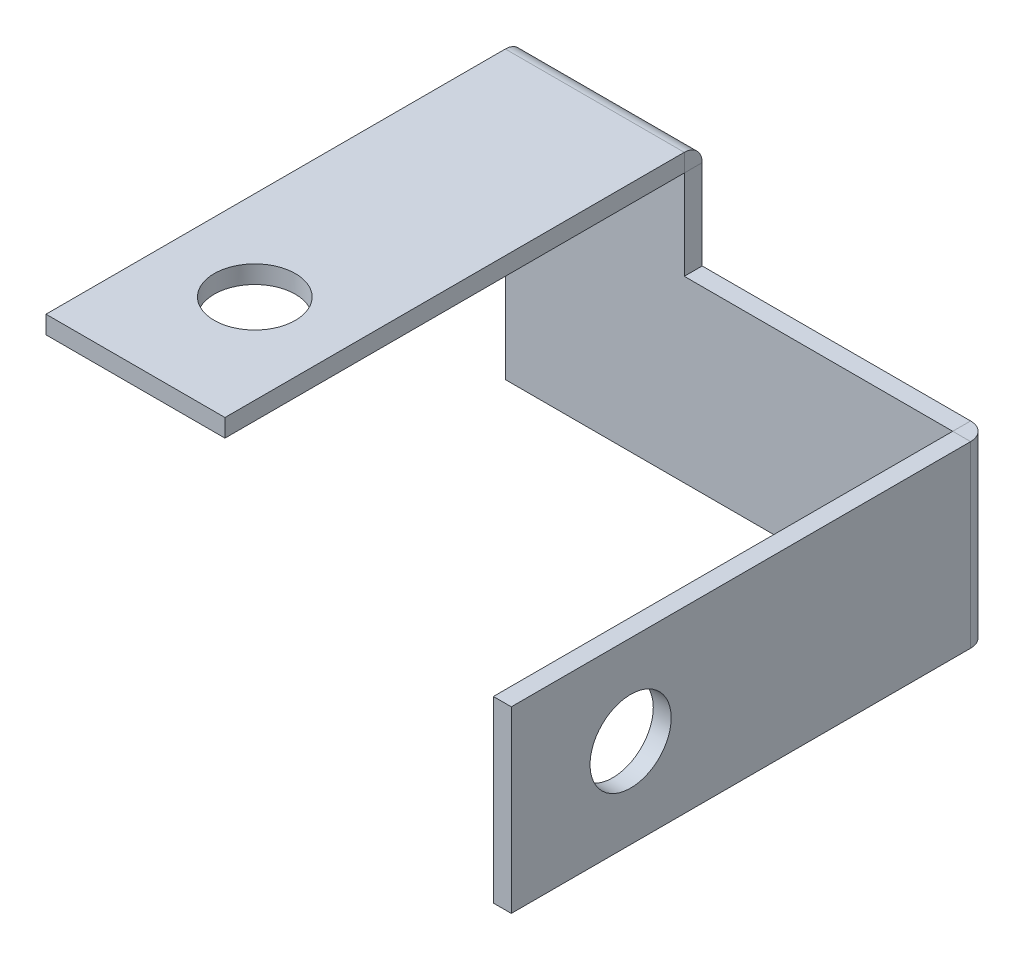
ISO-10303-21;
HEADER;
FILE_DESCRIPTION(('STEP AP214'),'2;1');
FILE_NAME('part.step','',(''),(''),'','','');
FILE_SCHEMA(('AUTOMOTIVE_DESIGN { 1 0 10303 214 1 1 1 1 }'));
ENDSEC;
DATA;
#1=APPLICATION_CONTEXT('core data for automotive mechanical design processes');
#2=APPLICATION_PROTOCOL_DEFINITION('international standard','automotive_design',2000,#1);
#3=PRODUCT_CONTEXT('',#1,'mechanical');
#4=PRODUCT('Part','Part','',(#3));
#5=PRODUCT_RELATED_PRODUCT_CATEGORY('part','',(#4));
#6=PRODUCT_DEFINITION_FORMATION('','',#4);
#7=PRODUCT_DEFINITION_CONTEXT('part definition',#1,'design');
#8=PRODUCT_DEFINITION('design','',#6,#7);
#9=PRODUCT_DEFINITION_SHAPE('','',#8);
#10=(LENGTH_UNIT() NAMED_UNIT(*) SI_UNIT(.MILLI.,.METRE.));
#11=(NAMED_UNIT(*) PLANE_ANGLE_UNIT() SI_UNIT($,.RADIAN.));
#12=(NAMED_UNIT(*) SI_UNIT($,.STERADIAN.) SOLID_ANGLE_UNIT());
#13=UNCERTAINTY_MEASURE_WITH_UNIT(LENGTH_MEASURE(1.E-05),#10,'distance_accuracy_value','');
#14=(GEOMETRIC_REPRESENTATION_CONTEXT(3) GLOBAL_UNCERTAINTY_ASSIGNED_CONTEXT((#13)) GLOBAL_UNIT_ASSIGNED_CONTEXT((#10,
#11,#12)) REPRESENTATION_CONTEXT('',''));
#15=CARTESIAN_POINT('',(0.,0.,0.));
#16=DIRECTION('',(0.,0.,1.));
#17=DIRECTION('',(1.,0.,0.));
#18=AXIS2_PLACEMENT_3D('',#15,#16,#17);
#19=CARTESIAN_POINT('',(0.,0.,-1.5));
#20=DIRECTION('',(0.,0.,-1.));
#21=DIRECTION('',(-1.,0.,0.));
#22=AXIS2_PLACEMENT_3D('',#19,#20,#21);
#23=PLANE('',#22);
#24=DIRECTION('',(-1.,0.,0.));
#25=VECTOR('',#24,1.);
#26=CARTESIAN_POINT('',(24.,0.,-1.5));
#27=LINE('',#26,#25);
#28=CARTESIAN_POINT('',(22.5,0.,-1.5));
#29=VERTEX_POINT('',#28);
#30=CARTESIAN_POINT('',(0.,0.,-1.5));
#31=VERTEX_POINT('',#30);
#32=EDGE_CURVE('E301',#29,#31,#27,.T.);
#33=ORIENTED_EDGE('',*,*,#32,.F.);
#34=DIRECTION('',(0.,1.,0.));
#35=VECTOR('',#34,1.);
#36=CARTESIAN_POINT('',(22.4999999999999,0.,-1.5));
#37=LINE('',#36,#35);
#38=CARTESIAN_POINT('',(22.5,-15.,-1.5));
#39=VERTEX_POINT('',#38);
#40=EDGE_CURVE('E227',#39,#29,#37,.T.);
#41=ORIENTED_EDGE('',*,*,#40,.F.);
#42=DIRECTION('',(1.,0.,0.));
#43=VECTOR('',#42,1.);
#44=CARTESIAN_POINT('',(-15.,-15.,-1.5));
#45=LINE('',#44,#43);
#46=CARTESIAN_POINT('',(-15.,-15.,-1.5));
#47=VERTEX_POINT('',#46);
#48=EDGE_CURVE('E311',#47,#39,#45,.T.);
#49=ORIENTED_EDGE('',*,*,#48,.F.);
#50=DIRECTION('',(0.,-1.,0.));
#51=VECTOR('',#50,1.);
#52=CARTESIAN_POINT('',(-15.,9.,-1.5));
#53=LINE('',#52,#51);
#54=CARTESIAN_POINT('',(-15.,7.50000000000001,-1.5));
#55=VERTEX_POINT('',#54);
#56=EDGE_CURVE('E308',#55,#47,#53,.T.);
#57=ORIENTED_EDGE('',*,*,#56,.F.);
#58=DIRECTION('',(-1.,0.,0.));
#59=VECTOR('',#58,1.);
#60=CARTESIAN_POINT('',(0.,7.49999999999996,-1.5));
#61=LINE('',#60,#59);
#62=CARTESIAN_POINT('',(0.,7.49999999999997,-1.5));
#63=VERTEX_POINT('',#62);
#64=EDGE_CURVE('E286',#63,#55,#61,.T.);
#65=ORIENTED_EDGE('',*,*,#64,.F.);
#66=DIRECTION('',(0.,1.,0.));
#67=VECTOR('',#66,1.);
#68=CARTESIAN_POINT('',(0.,0.,-1.5));
#69=LINE('',#68,#67);
#70=EDGE_CURVE('E304',#31,#63,#69,.T.);
#71=ORIENTED_EDGE('',*,*,#70,.F.);
#72=EDGE_LOOP('',(#33,#41,#49,#57,#65,#71));
#73=FACE_BOUND('',#72,.T.);
#74=ADVANCED_FACE('F82',(#73),#23,.T.);
#75=CARTESIAN_POINT('',(0.,0.,0.));
#76=DIRECTION('',(0.,0.,-1.));
#77=DIRECTION('',(-1.,0.,0.));
#78=AXIS2_PLACEMENT_3D('',#75,#76,#77);
#79=PLANE('',#78);
#80=DIRECTION('',(0.,-1.,0.));
#81=VECTOR('',#80,1.);
#82=CARTESIAN_POINT('',(22.5,-15.,0.));
#83=LINE('',#82,#81);
#84=CARTESIAN_POINT('',(22.5,-15.,0.));
#85=VERTEX_POINT('',#84);
#86=CARTESIAN_POINT('',(22.5,0.,0.));
#87=VERTEX_POINT('',#86);
#88=EDGE_CURVE('E217',#85,#87,#83,.F.);
#89=ORIENTED_EDGE('',*,*,#88,.T.);
#90=DIRECTION('',(-1.,0.,0.));
#91=VECTOR('',#90,1.);
#92=CARTESIAN_POINT('',(24.,0.,0.));
#93=LINE('',#92,#91);
#94=CARTESIAN_POINT('',(0.,0.,0.));
#95=VERTEX_POINT('',#94);
#96=EDGE_CURVE('E300',#87,#95,#93,.T.);
#97=ORIENTED_EDGE('',*,*,#96,.T.);
#98=DIRECTION('',(0.,1.,0.));
#99=VECTOR('',#98,1.);
#100=CARTESIAN_POINT('',(0.,0.,0.));
#101=LINE('',#100,#99);
#102=CARTESIAN_POINT('',(0.,7.5,0.));
#103=VERTEX_POINT('',#102);
#104=EDGE_CURVE('E316',#95,#103,#101,.T.);
#105=ORIENTED_EDGE('',*,*,#104,.T.);
#106=DIRECTION('',(1.,0.,0.));
#107=VECTOR('',#106,1.);
#108=CARTESIAN_POINT('',(0.,7.5,0.));
#109=LINE('',#108,#107);
#110=CARTESIAN_POINT('',(-15.,7.5,0.));
#111=VERTEX_POINT('',#110);
#112=EDGE_CURVE('E277',#103,#111,#109,.F.);
#113=ORIENTED_EDGE('',*,*,#112,.T.);
#114=DIRECTION('',(0.,-1.,0.));
#115=VECTOR('',#114,1.);
#116=CARTESIAN_POINT('',(-15.,9.,0.));
#117=LINE('',#116,#115);
#118=CARTESIAN_POINT('',(-15.,-15.,0.));
#119=VERTEX_POINT('',#118);
#120=EDGE_CURVE('E319',#111,#119,#117,.T.);
#121=ORIENTED_EDGE('',*,*,#120,.T.);
#122=DIRECTION('',(1.,0.,0.));
#123=VECTOR('',#122,1.);
#124=CARTESIAN_POINT('',(-15.,-15.,0.));
#125=LINE('',#124,#123);
#126=EDGE_CURVE('E305',#119,#85,#125,.T.);
#127=ORIENTED_EDGE('',*,*,#126,.T.);
#128=EDGE_LOOP('',(#89,#97,#105,#113,#121,#127));
#129=FACE_BOUND('',#128,.T.);
#130=ADVANCED_FACE('F333',(#129),#79,.F.);
#131=CARTESIAN_POINT('',(24.,0.,-1.5));
#132=DIRECTION('',(0.,1.,0.));
#133=DIRECTION('',(-1.,0.,0.));
#134=AXIS2_PLACEMENT_3D('',#131,#132,#133);
#135=PLANE('',#134);
#136=ORIENTED_EDGE('',*,*,#96,.F.);
#137=DIRECTION('',(0.,0.,1.));
#138=VECTOR('',#137,1.);
#139=CARTESIAN_POINT('',(22.5,0.,-1.5));
#140=LINE('',#139,#138);
#141=EDGE_CURVE('E100',#29,#87,#140,.T.);
#142=ORIENTED_EDGE('',*,*,#141,.F.);
#143=ORIENTED_EDGE('',*,*,#32,.T.);
#144=DIRECTION('',(0.,0.,1.));
#145=VECTOR('',#144,1.);
#146=CARTESIAN_POINT('',(0.,0.,-1.5));
#147=LINE('',#146,#145);
#148=EDGE_CURVE('E92',#31,#95,#147,.T.);
#149=ORIENTED_EDGE('',*,*,#148,.T.);
#150=EDGE_LOOP('',(#136,#142,#143,#149));
#151=FACE_BOUND('',#150,.T.);
#152=ADVANCED_FACE('F84',(#151),#135,.T.);
#153=CARTESIAN_POINT('',(-15.,9.,-1.5));
#154=DIRECTION('',(-1.,0.,0.));
#155=DIRECTION('',(0.,-1.,0.));
#156=AXIS2_PLACEMENT_3D('',#153,#154,#155);
#157=PLANE('',#156);
#158=ORIENTED_EDGE('',*,*,#120,.F.);
#159=DIRECTION('',(0.,0.,1.));
#160=VECTOR('',#159,1.);
#161=CARTESIAN_POINT('',(-15.,7.49999999999999,-1.5));
#162=LINE('',#161,#160);
#163=EDGE_CURVE('E244',#55,#111,#162,.T.);
#164=ORIENTED_EDGE('',*,*,#163,.F.);
#165=ORIENTED_EDGE('',*,*,#56,.T.);
#166=DIRECTION('',(0.,0.,1.));
#167=VECTOR('',#166,1.);
#168=CARTESIAN_POINT('',(-15.,-15.,-1.5));
#169=LINE('',#168,#167);
#170=EDGE_CURVE('E13',#47,#119,#169,.T.);
#171=ORIENTED_EDGE('',*,*,#170,.T.);
#172=EDGE_LOOP('',(#158,#164,#165,#171));
#173=FACE_BOUND('',#172,.T.);
#174=ADVANCED_FACE('F377',(#173),#157,.T.);
#175=CARTESIAN_POINT('',(-15.,-15.,-1.5));
#176=DIRECTION('',(0.,-1.,0.));
#177=DIRECTION('',(0.,0.,-1.));
#178=AXIS2_PLACEMENT_3D('',#175,#176,#177);
#179=PLANE('',#178);
#180=DIRECTION('',(0.,0.,1.));
#181=VECTOR('',#180,1.);
#182=CARTESIAN_POINT('',(22.5,-15.,-1.5));
#183=LINE('',#182,#181);
#184=EDGE_CURVE('E108',#39,#85,#183,.T.);
#185=ORIENTED_EDGE('',*,*,#184,.T.);
#186=ORIENTED_EDGE('',*,*,#126,.F.);
#187=ORIENTED_EDGE('',*,*,#170,.F.);
#188=ORIENTED_EDGE('',*,*,#48,.T.);
#189=EDGE_LOOP('',(#185,#186,#187,#188));
#190=FACE_BOUND('',#189,.T.);
#191=ADVANCED_FACE('F374',(#190),#179,.T.);
#192=CARTESIAN_POINT('',(0.,0.,-1.5));
#193=DIRECTION('',(1.,0.,0.));
#194=DIRECTION('',(0.,0.,-1.));
#195=AXIS2_PLACEMENT_3D('',#192,#193,#194);
#196=PLANE('',#195);
#197=DIRECTION('',(0.,0.,1.));
#198=VECTOR('',#197,1.);
#199=CARTESIAN_POINT('',(0.,7.49999999999999,-1.5));
#200=LINE('',#199,#198);
#201=EDGE_CURVE('E290',#63,#103,#200,.T.);
#202=ORIENTED_EDGE('',*,*,#201,.T.);
#203=ORIENTED_EDGE('',*,*,#104,.F.);
#204=ORIENTED_EDGE('',*,*,#148,.F.);
#205=ORIENTED_EDGE('',*,*,#70,.T.);
#206=EDGE_LOOP('',(#202,#203,#204,#205));
#207=FACE_BOUND('',#206,.T.);
#208=ADVANCED_FACE('F330',(#207),#196,.T.);
#209=CARTESIAN_POINT('',(-15.,7.49999999999999,-1.5));
#210=DIRECTION('',(-1.,0.,0.));
#211=DIRECTION('',(0.,-1.,0.));
#212=AXIS2_PLACEMENT_3D('',#209,#210,#211);
#213=PLANE('',#212);
#214=CARTESIAN_POINT('',(-15.,7.5,0.));
#215=DIRECTION('',(1.,0.,0.));
#216=DIRECTION('',(0.,1.,0.));
#217=AXIS2_PLACEMENT_3D('',#214,#215,#216);
#218=CIRCLE('',#217,1.5);
#219=CARTESIAN_POINT('',(-15.,9.,0.));
#220=VERTEX_POINT('',#219);
#221=EDGE_CURVE('E297',#55,#220,#218,.T.);
#222=ORIENTED_EDGE('',*,*,#221,.F.);
#223=ORIENTED_EDGE('',*,*,#163,.T.);
#224=DIRECTION('',(0.,-1.,0.));
#225=VECTOR('',#224,1.);
#226=CARTESIAN_POINT('',(-15.,9.,0.));
#227=LINE('',#226,#225);
#228=EDGE_CURVE('E245',#220,#111,#227,.T.);
#229=ORIENTED_EDGE('',*,*,#228,.F.);
#230=EDGE_LOOP('',(#222,#223,#229));
#231=FACE_BOUND('',#230,.T.);
#232=ADVANCED_FACE('F371',(#231),#213,.T.);
#233=CARTESIAN_POINT('',(0.,7.5,0.));
#234=DIRECTION('',(1.,0.,0.));
#235=DIRECTION('',(0.,1.,0.));
#236=AXIS2_PLACEMENT_3D('',#233,#234,#235);
#237=CYLINDRICAL_SURFACE('',#236,1.5);
#238=CARTESIAN_POINT('',(0.,7.5,0.));
#239=DIRECTION('',(1.,0.,0.));
#240=DIRECTION('',(0.,1.,0.));
#241=AXIS2_PLACEMENT_3D('',#238,#239,#240);
#242=CIRCLE('',#241,1.5);
#243=CARTESIAN_POINT('',(0.,9.,0.));
#244=VERTEX_POINT('',#243);
#245=EDGE_CURVE('E294',#63,#244,#242,.T.);
#246=ORIENTED_EDGE('',*,*,#245,.F.);
#247=ORIENTED_EDGE('',*,*,#64,.T.);
#248=ORIENTED_EDGE('',*,*,#221,.T.);
#249=DIRECTION('',(-1.,0.,0.));
#250=VECTOR('',#249,1.);
#251=CARTESIAN_POINT('',(0.,9.,0.));
#252=LINE('',#251,#250);
#253=EDGE_CURVE('E263',#244,#220,#252,.T.);
#254=ORIENTED_EDGE('',*,*,#253,.F.);
#255=EDGE_LOOP('',(#246,#247,#248,#254));
#256=FACE_BOUND('',#255,.T.);
#257=ADVANCED_FACE('F384',(#256),#237,.T.);
#258=CARTESIAN_POINT('',(0.,7.49999999999999,-1.5));
#259=DIRECTION('',(-1.,0.,0.));
#260=DIRECTION('',(0.,-1.,0.));
#261=AXIS2_PLACEMENT_3D('',#258,#259,#260);
#262=PLANE('',#261);
#263=ORIENTED_EDGE('',*,*,#201,.F.);
#264=ORIENTED_EDGE('',*,*,#245,.T.);
#265=DIRECTION('',(0.,-1.,0.));
#266=VECTOR('',#265,1.);
#267=CARTESIAN_POINT('',(0.,9.,0.));
#268=LINE('',#267,#266);
#269=EDGE_CURVE('E240',#244,#103,#268,.T.);
#270=ORIENTED_EDGE('',*,*,#269,.T.);
#271=EDGE_LOOP('',(#263,#264,#270));
#272=FACE_BOUND('',#271,.T.);
#273=ADVANCED_FACE('F389',(#272),#262,.F.);
#274=CARTESIAN_POINT('',(0.,9.,0.));
#275=DIRECTION('',(-1.,0.,0.));
#276=DIRECTION('',(0.,-1.,0.));
#277=AXIS2_PLACEMENT_3D('',#274,#275,#276);
#278=PLANE('',#277);
#279=DIRECTION('',(0.,0.,1.));
#280=VECTOR('',#279,1.);
#281=CARTESIAN_POINT('',(0.,7.5,0.));
#282=LINE('',#281,#280);
#283=CARTESIAN_POINT('',(0.,7.50000000000013,38.5));
#284=VERTEX_POINT('',#283);
#285=EDGE_CURVE('E239',#284,#103,#282,.F.);
#286=ORIENTED_EDGE('',*,*,#285,.T.);
#287=ORIENTED_EDGE('',*,*,#269,.F.);
#288=DIRECTION('',(0.,0.,-1.));
#289=VECTOR('',#288,1.);
#290=CARTESIAN_POINT('',(0.,9.,0.));
#291=LINE('',#290,#289);
#292=CARTESIAN_POINT('',(0.,9.00000000000013,38.5));
#293=VERTEX_POINT('',#292);
#294=EDGE_CURVE('E267',#293,#244,#291,.T.);
#295=ORIENTED_EDGE('',*,*,#294,.F.);
#296=DIRECTION('',(0.,-1.,0.));
#297=VECTOR('',#296,1.);
#298=CARTESIAN_POINT('',(0.,9.00000000000013,38.5));
#299=LINE('',#298,#297);
#300=EDGE_CURVE('E253',#293,#284,#299,.T.);
#301=ORIENTED_EDGE('',*,*,#300,.T.);
#302=EDGE_LOOP('',(#286,#287,#295,#301));
#303=FACE_BOUND('',#302,.T.);
#304=ADVANCED_FACE('F449',(#303),#278,.F.);
#305=CARTESIAN_POINT('',(-15.,9.00000000000013,38.5));
#306=DIRECTION('',(1.,0.,0.));
#307=DIRECTION('',(0.,1.,0.));
#308=AXIS2_PLACEMENT_3D('',#305,#306,#307);
#309=PLANE('',#308);
#310=DIRECTION('',(0.,0.,-1.));
#311=VECTOR('',#310,1.);
#312=CARTESIAN_POINT('',(-15.,7.50000000000013,38.5));
#313=LINE('',#312,#311);
#314=CARTESIAN_POINT('',(-15.,7.50000000000013,38.5));
#315=VERTEX_POINT('',#314);
#316=EDGE_CURVE('E274',#111,#315,#313,.F.);
#317=ORIENTED_EDGE('',*,*,#316,.T.);
#318=DIRECTION('',(0.,-1.,0.));
#319=VECTOR('',#318,1.);
#320=CARTESIAN_POINT('',(-15.,9.00000000000013,38.5));
#321=LINE('',#320,#319);
#322=CARTESIAN_POINT('',(-15.,9.00000000000013,38.5));
#323=VERTEX_POINT('',#322);
#324=EDGE_CURVE('E249',#323,#315,#321,.T.);
#325=ORIENTED_EDGE('',*,*,#324,.F.);
#326=DIRECTION('',(0.,0.,1.));
#327=VECTOR('',#326,1.);
#328=CARTESIAN_POINT('',(-15.,9.,0.));
#329=LINE('',#328,#327);
#330=EDGE_CURVE('E260',#220,#323,#329,.T.);
#331=ORIENTED_EDGE('',*,*,#330,.F.);
#332=ORIENTED_EDGE('',*,*,#228,.T.);
#333=EDGE_LOOP('',(#317,#325,#331,#332));
#334=FACE_BOUND('',#333,.T.);
#335=ADVANCED_FACE('F458',(#334),#309,.F.);
#336=CARTESIAN_POINT('',(0.,9.00000000000013,38.5));
#337=DIRECTION('',(0.,0.,-1.));
#338=DIRECTION('',(0.,1.,0.));
#339=AXIS2_PLACEMENT_3D('',#336,#337,#338);
#340=PLANE('',#339);
#341=DIRECTION('',(-1.,0.,0.));
#342=VECTOR('',#341,1.);
#343=CARTESIAN_POINT('',(0.,7.50000000000013,38.5));
#344=LINE('',#343,#342);
#345=EDGE_CURVE('E271',#315,#284,#344,.F.);
#346=ORIENTED_EDGE('',*,*,#345,.T.);
#347=ORIENTED_EDGE('',*,*,#300,.F.);
#348=DIRECTION('',(1.,0.,0.));
#349=VECTOR('',#348,1.);
#350=CARTESIAN_POINT('',(0.,9.00000000000013,38.5));
#351=LINE('',#350,#349);
#352=EDGE_CURVE('E257',#323,#293,#351,.T.);
#353=ORIENTED_EDGE('',*,*,#352,.F.);
#354=ORIENTED_EDGE('',*,*,#324,.T.);
#355=EDGE_LOOP('',(#346,#347,#353,#354));
#356=FACE_BOUND('',#355,.T.);
#357=ADVANCED_FACE('F454',(#356),#340,.F.);
#358=CARTESIAN_POINT('',(0.,9.,0.));
#359=DIRECTION('',(0.,-1.,0.));
#360=DIRECTION('',(0.,0.,-1.));
#361=AXIS2_PLACEMENT_3D('',#358,#359,#360);
#362=PLANE('',#361);
#363=CARTESIAN_POINT('',(-7.5,9.00000000000014,28.5));
#364=DIRECTION('',(0.,1.,0.));
#365=DIRECTION('',(0.,0.,1.));
#366=AXIS2_PLACEMENT_3D('',#363,#364,#365);
#367=CIRCLE('',#366,3.39999999999999);
#368=CARTESIAN_POINT('',(-7.5,9.00000000000015,31.9));
#369=VERTEX_POINT('',#368);
#370=EDGE_CURVE('E426',#369,#369,#367,.T.);
#371=ORIENTED_EDGE('',*,*,#370,.F.);
#372=EDGE_LOOP('',(#371));
#373=FACE_BOUND('',#372,.T.);
#374=ORIENTED_EDGE('',*,*,#294,.T.);
#375=ORIENTED_EDGE('',*,*,#253,.T.);
#376=ORIENTED_EDGE('',*,*,#330,.T.);
#377=ORIENTED_EDGE('',*,*,#352,.T.);
#378=EDGE_LOOP('',(#374,#375,#376,#377));
#379=FACE_BOUND('',#378,.T.);
#380=ADVANCED_FACE('F442',(#373,#379),#362,.F.);
#381=CARTESIAN_POINT('',(0.,7.5,0.));
#382=DIRECTION('',(0.,-1.,0.));
#383=DIRECTION('',(0.,0.,-1.));
#384=AXIS2_PLACEMENT_3D('',#381,#382,#383);
#385=PLANE('',#384);
#386=CARTESIAN_POINT('',(-7.5,7.5000000000001,28.5));
#387=DIRECTION('',(0.,-1.,0.));
#388=DIRECTION('',(0.,0.,-1.));
#389=AXIS2_PLACEMENT_3D('',#386,#387,#388);
#390=CIRCLE('',#389,3.39999999999999);
#391=CARTESIAN_POINT('',(-7.5,7.50000000000009,25.1));
#392=VERTEX_POINT('',#391);
#393=EDGE_CURVE('E86',#392,#392,#390,.T.);
#394=ORIENTED_EDGE('',*,*,#393,.F.);
#395=EDGE_LOOP('',(#394));
#396=FACE_BOUND('',#395,.T.);
#397=ORIENTED_EDGE('',*,*,#285,.F.);
#398=ORIENTED_EDGE('',*,*,#345,.F.);
#399=ORIENTED_EDGE('',*,*,#316,.F.);
#400=ORIENTED_EDGE('',*,*,#112,.F.);
#401=EDGE_LOOP('',(#397,#398,#399,#400));
#402=FACE_BOUND('',#401,.T.);
#403=ADVANCED_FACE('F438',(#396,#402),#385,.T.);
#404=CARTESIAN_POINT('',(22.5,0.,-1.5));
#405=DIRECTION('',(0.,1.,0.));
#406=DIRECTION('',(-1.,0.,0.));
#407=AXIS2_PLACEMENT_3D('',#404,#405,#406);
#408=PLANE('',#407);
#409=CARTESIAN_POINT('',(22.5,0.,0.));
#410=DIRECTION('',(0.,-1.,0.));
#411=DIRECTION('',(1.,0.,0.));
#412=AXIS2_PLACEMENT_3D('',#409,#410,#411);
#413=CIRCLE('',#412,1.5);
#414=CARTESIAN_POINT('',(24.,0.,0.));
#415=VERTEX_POINT('',#414);
#416=EDGE_CURVE('E236',#29,#415,#413,.T.);
#417=ORIENTED_EDGE('',*,*,#416,.F.);
#418=ORIENTED_EDGE('',*,*,#141,.T.);
#419=DIRECTION('',(-1.,0.,0.));
#420=VECTOR('',#419,1.);
#421=CARTESIAN_POINT('',(24.,0.,0.));
#422=LINE('',#421,#420);
#423=EDGE_CURVE('E341',#415,#87,#422,.T.);
#424=ORIENTED_EDGE('',*,*,#423,.F.);
#425=EDGE_LOOP('',(#417,#418,#424));
#426=FACE_BOUND('',#425,.T.);
#427=ADVANCED_FACE('F441',(#426),#408,.T.);
#428=CARTESIAN_POINT('',(22.5,-15.,0.));
#429=DIRECTION('',(0.,-1.,0.));
#430=DIRECTION('',(1.,0.,0.));
#431=AXIS2_PLACEMENT_3D('',#428,#429,#430);
#432=CYLINDRICAL_SURFACE('',#431,1.5);
#433=CARTESIAN_POINT('',(22.5,-15.,0.));
#434=DIRECTION('',(0.,-1.,0.));
#435=DIRECTION('',(1.,0.,0.));
#436=AXIS2_PLACEMENT_3D('',#433,#434,#435);
#437=CIRCLE('',#436,1.5);
#438=CARTESIAN_POINT('',(24.,-15.,0.));
#439=VERTEX_POINT('',#438);
#440=EDGE_CURVE('E233',#39,#439,#437,.T.);
#441=ORIENTED_EDGE('',*,*,#440,.F.);
#442=ORIENTED_EDGE('',*,*,#40,.T.);
#443=ORIENTED_EDGE('',*,*,#416,.T.);
#444=DIRECTION('',(0.,1.,0.));
#445=VECTOR('',#444,1.);
#446=CARTESIAN_POINT('',(24.,0.,0.));
#447=LINE('',#446,#445);
#448=EDGE_CURVE('E205',#439,#415,#447,.T.);
#449=ORIENTED_EDGE('',*,*,#448,.F.);
#450=EDGE_LOOP('',(#441,#442,#443,#449));
#451=FACE_BOUND('',#450,.T.);
#452=ADVANCED_FACE('F403',(#451),#432,.T.);
#453=CARTESIAN_POINT('',(22.5,-15.,-1.5));
#454=DIRECTION('',(0.,1.,0.));
#455=DIRECTION('',(-1.,0.,0.));
#456=AXIS2_PLACEMENT_3D('',#453,#454,#455);
#457=PLANE('',#456);
#458=ORIENTED_EDGE('',*,*,#184,.F.);
#459=ORIENTED_EDGE('',*,*,#440,.T.);
#460=DIRECTION('',(-1.,0.,0.));
#461=VECTOR('',#460,1.);
#462=CARTESIAN_POINT('',(24.,-15.,0.));
#463=LINE('',#462,#461);
#464=EDGE_CURVE('E203',#439,#85,#463,.T.);
#465=ORIENTED_EDGE('',*,*,#464,.T.);
#466=EDGE_LOOP('',(#458,#459,#465));
#467=FACE_BOUND('',#466,.T.);
#468=ADVANCED_FACE('F405',(#467),#457,.F.);
#469=CARTESIAN_POINT('',(24.,-15.,0.));
#470=DIRECTION('',(0.,1.,0.));
#471=DIRECTION('',(-1.,0.,0.));
#472=AXIS2_PLACEMENT_3D('',#469,#470,#471);
#473=PLANE('',#472);
#474=DIRECTION('',(0.,0.,1.));
#475=VECTOR('',#474,1.);
#476=CARTESIAN_POINT('',(22.5,-15.,0.));
#477=LINE('',#476,#475);
#478=CARTESIAN_POINT('',(22.5000000000001,-15.,38.5));
#479=VERTEX_POINT('',#478);
#480=EDGE_CURVE('E221',#479,#85,#477,.F.);
#481=ORIENTED_EDGE('',*,*,#480,.T.);
#482=ORIENTED_EDGE('',*,*,#464,.F.);
#483=DIRECTION('',(0.,0.,-1.));
#484=VECTOR('',#483,1.);
#485=CARTESIAN_POINT('',(24.,-15.,0.));
#486=LINE('',#485,#484);
#487=CARTESIAN_POINT('',(24.0000000000001,-15.,38.5));
#488=VERTEX_POINT('',#487);
#489=EDGE_CURVE('E181',#488,#439,#486,.T.);
#490=ORIENTED_EDGE('',*,*,#489,.F.);
#491=DIRECTION('',(-1.,0.,0.));
#492=VECTOR('',#491,1.);
#493=CARTESIAN_POINT('',(24.0000000000001,-15.,38.5));
#494=LINE('',#493,#492);
#495=EDGE_CURVE('E189',#488,#479,#494,.T.);
#496=ORIENTED_EDGE('',*,*,#495,.T.);
#497=EDGE_LOOP('',(#481,#482,#490,#496));
#498=FACE_BOUND('',#497,.T.);
#499=ADVANCED_FACE('F201',(#498),#473,.F.);
#500=CARTESIAN_POINT('',(24.0000000000001,0.,38.5));
#501=DIRECTION('',(0.,-1.,0.));
#502=DIRECTION('',(1.,0.,0.));
#503=AXIS2_PLACEMENT_3D('',#500,#501,#502);
#504=PLANE('',#503);
#505=DIRECTION('',(0.,0.,-1.));
#506=VECTOR('',#505,1.);
#507=CARTESIAN_POINT('',(22.5000000000001,0.,38.5));
#508=LINE('',#507,#506);
#509=CARTESIAN_POINT('',(22.5000000000001,0.,38.5));
#510=VERTEX_POINT('',#509);
#511=EDGE_CURVE('E211',#87,#510,#508,.F.);
#512=ORIENTED_EDGE('',*,*,#511,.T.);
#513=DIRECTION('',(-1.,0.,0.));
#514=VECTOR('',#513,1.);
#515=CARTESIAN_POINT('',(24.0000000000001,0.,38.5));
#516=LINE('',#515,#514);
#517=CARTESIAN_POINT('',(24.0000000000001,0.,38.5));
#518=VERTEX_POINT('',#517);
#519=EDGE_CURVE('E199',#518,#510,#516,.T.);
#520=ORIENTED_EDGE('',*,*,#519,.F.);
#521=DIRECTION('',(0.,0.,1.));
#522=VECTOR('',#521,1.);
#523=CARTESIAN_POINT('',(24.,0.,0.));
#524=LINE('',#523,#522);
#525=EDGE_CURVE('E184',#415,#518,#524,.T.);
#526=ORIENTED_EDGE('',*,*,#525,.F.);
#527=ORIENTED_EDGE('',*,*,#423,.T.);
#528=EDGE_LOOP('',(#512,#520,#526,#527));
#529=FACE_BOUND('',#528,.T.);
#530=ADVANCED_FACE('F342',(#529),#504,.F.);
#531=CARTESIAN_POINT('',(24.0000000000001,-15.,38.5));
#532=DIRECTION('',(0.,0.,-1.));
#533=DIRECTION('',(-1.,0.,0.));
#534=AXIS2_PLACEMENT_3D('',#531,#532,#533);
#535=PLANE('',#534);
#536=DIRECTION('',(0.,1.,0.));
#537=VECTOR('',#536,1.);
#538=CARTESIAN_POINT('',(22.5000000000001,-15.,38.5));
#539=LINE('',#538,#537);
#540=EDGE_CURVE('E194',#510,#479,#539,.F.);
#541=ORIENTED_EDGE('',*,*,#540,.T.);
#542=ORIENTED_EDGE('',*,*,#495,.F.);
#543=DIRECTION('',(0.,-1.,0.));
#544=VECTOR('',#543,1.);
#545=CARTESIAN_POINT('',(24.0000000000001,0.,38.5));
#546=LINE('',#545,#544);
#547=EDGE_CURVE('E176',#518,#488,#546,.T.);
#548=ORIENTED_EDGE('',*,*,#547,.F.);
#549=ORIENTED_EDGE('',*,*,#519,.T.);
#550=EDGE_LOOP('',(#541,#542,#548,#549));
#551=FACE_BOUND('',#550,.T.);
#552=ADVANCED_FACE('F192',(#551),#535,.F.);
#553=CARTESIAN_POINT('',(24.,0.,0.));
#554=DIRECTION('',(-1.,0.,0.));
#555=DIRECTION('',(0.,0.,1.));
#556=AXIS2_PLACEMENT_3D('',#553,#554,#555);
#557=PLANE('',#556);
#558=CARTESIAN_POINT('',(24.0000000000001,-7.5,28.5));
#559=DIRECTION('',(1.,0.,0.));
#560=DIRECTION('',(0.,0.,-1.));
#561=AXIS2_PLACEMENT_3D('',#558,#559,#560);
#562=CIRCLE('',#561,3.39999999999999);
#563=CARTESIAN_POINT('',(24.0000000000001,-7.5,25.1));
#564=VERTEX_POINT('',#563);
#565=EDGE_CURVE('E422',#564,#564,#562,.T.);
#566=ORIENTED_EDGE('',*,*,#565,.F.);
#567=EDGE_LOOP('',(#566));
#568=FACE_BOUND('',#567,.T.);
#569=ORIENTED_EDGE('',*,*,#489,.T.);
#570=ORIENTED_EDGE('',*,*,#448,.T.);
#571=ORIENTED_EDGE('',*,*,#525,.T.);
#572=ORIENTED_EDGE('',*,*,#547,.T.);
#573=EDGE_LOOP('',(#569,#570,#571,#572));
#574=FACE_BOUND('',#573,.T.);
#575=ADVANCED_FACE('F178',(#568,#574),#557,.F.);
#576=CARTESIAN_POINT('',(22.5,0.,0.));
#577=DIRECTION('',(-1.,0.,0.));
#578=DIRECTION('',(0.,0.,1.));
#579=AXIS2_PLACEMENT_3D('',#576,#577,#578);
#580=PLANE('',#579);
#581=CARTESIAN_POINT('',(22.5000000000001,-7.5,28.5));
#582=DIRECTION('',(-1.,0.,0.));
#583=DIRECTION('',(0.,0.,1.));
#584=AXIS2_PLACEMENT_3D('',#581,#582,#583);
#585=CIRCLE('',#584,3.39999999999999);
#586=CARTESIAN_POINT('',(22.5000000000001,-7.5,31.9));
#587=VERTEX_POINT('',#586);
#588=EDGE_CURVE('E224',#587,#587,#585,.T.);
#589=ORIENTED_EDGE('',*,*,#588,.F.);
#590=EDGE_LOOP('',(#589));
#591=FACE_BOUND('',#590,.T.);
#592=ORIENTED_EDGE('',*,*,#480,.F.);
#593=ORIENTED_EDGE('',*,*,#540,.F.);
#594=ORIENTED_EDGE('',*,*,#511,.F.);
#595=ORIENTED_EDGE('',*,*,#88,.F.);
#596=EDGE_LOOP('',(#592,#593,#594,#595));
#597=FACE_BOUND('',#596,.T.);
#598=ADVANCED_FACE('F347',(#591,#597),#580,.T.);
#599=CARTESIAN_POINT('',(24.0000000000001,-7.5,28.5));
#600=DIRECTION('',(1.,0.,0.));
#601=DIRECTION('',(0.,0.,-1.));
#602=AXIS2_PLACEMENT_3D('',#599,#600,#601);
#603=CYLINDRICAL_SURFACE('',#602,3.39999999999999);
#604=ORIENTED_EDGE('',*,*,#588,.T.);
#605=EDGE_LOOP('',(#604));
#606=FACE_BOUND('',#605,.T.);
#607=ORIENTED_EDGE('',*,*,#565,.T.);
#608=EDGE_LOOP('',(#607));
#609=FACE_BOUND('',#608,.T.);
#610=ADVANCED_FACE('F349',(#606,#609),#603,.F.);
#611=CARTESIAN_POINT('',(-7.5,9.00000000000013,28.5));
#612=DIRECTION('',(0.,1.,0.));
#613=DIRECTION('',(0.,0.,1.));
#614=AXIS2_PLACEMENT_3D('',#611,#612,#613);
#615=CYLINDRICAL_SURFACE('',#614,3.39999999999999);
#616=ORIENTED_EDGE('',*,*,#393,.T.);
#617=EDGE_LOOP('',(#616));
#618=FACE_BOUND('',#617,.T.);
#619=ORIENTED_EDGE('',*,*,#370,.T.);
#620=EDGE_LOOP('',(#619));
#621=FACE_BOUND('',#620,.T.);
#622=ADVANCED_FACE('F356',(#618,#621),#615,.F.);
#623=CLOSED_SHELL('',(#74,#130,#152,#174,#191,#208,#232,#257,#273,#304,#335,#357,#380,#403,#427,
#452,#468,#499,#530,#552,#575,#598,#610,#622));
#624=MANIFOLD_SOLID_BREP('B2',#623);
#625=ADVANCED_BREP_SHAPE_REPRESENTATION('',(#18,#624),#14);
#626=SHAPE_DEFINITION_REPRESENTATION(#9,#625);
ENDSEC;
END-ISO-10303-21;
